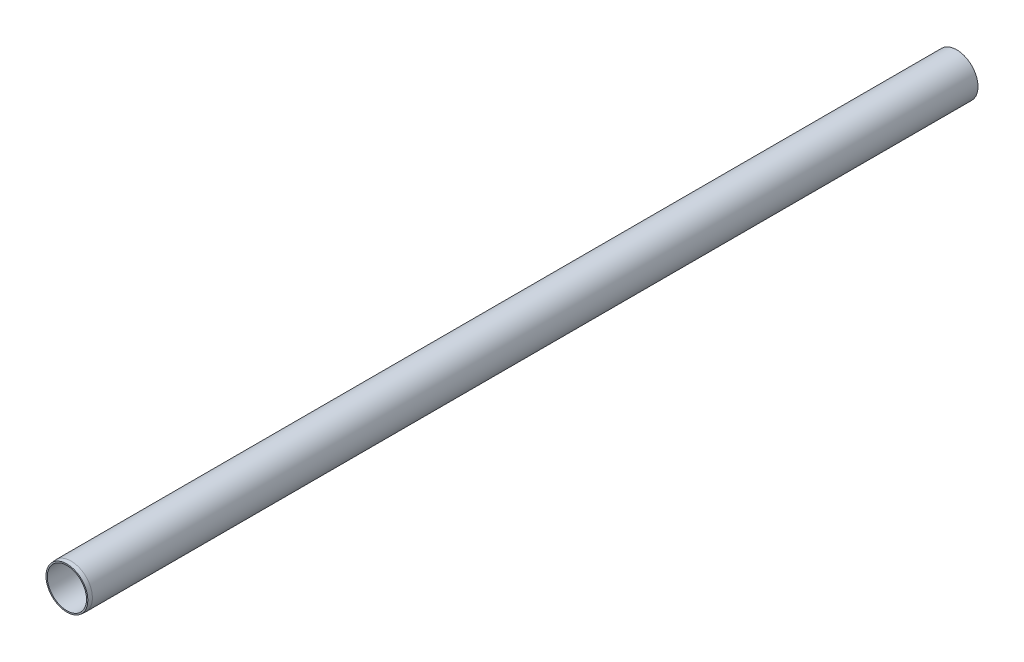
ISO-10303-21;
HEADER;
FILE_DESCRIPTION(('STEP AP214'),'2;1');
FILE_NAME('part.step','',(''),(''),'','','');
FILE_SCHEMA(('AUTOMOTIVE_DESIGN { 1 0 10303 214 1 1 1 1 }'));
ENDSEC;
DATA;
#1=APPLICATION_CONTEXT('core data for automotive mechanical design processes');
#2=APPLICATION_PROTOCOL_DEFINITION('international standard','automotive_design',2000,#1);
#3=PRODUCT_CONTEXT('',#1,'mechanical');
#4=PRODUCT('Part','Part','',(#3));
#5=PRODUCT_RELATED_PRODUCT_CATEGORY('part','',(#4));
#6=PRODUCT_DEFINITION_FORMATION('','',#4);
#7=PRODUCT_DEFINITION_CONTEXT('part definition',#1,'design');
#8=PRODUCT_DEFINITION('design','',#6,#7);
#9=PRODUCT_DEFINITION_SHAPE('','',#8);
#10=(LENGTH_UNIT() NAMED_UNIT(*) SI_UNIT(.MILLI.,.METRE.));
#11=(NAMED_UNIT(*) PLANE_ANGLE_UNIT() SI_UNIT($,.RADIAN.));
#12=(NAMED_UNIT(*) SI_UNIT($,.STERADIAN.) SOLID_ANGLE_UNIT());
#13=UNCERTAINTY_MEASURE_WITH_UNIT(LENGTH_MEASURE(1.E-05),#10,'distance_accuracy_value','');
#14=(GEOMETRIC_REPRESENTATION_CONTEXT(3) GLOBAL_UNCERTAINTY_ASSIGNED_CONTEXT((#13)) GLOBAL_UNIT_ASSIGNED_CONTEXT((#10,
#11,#12)) REPRESENTATION_CONTEXT('',''));
#15=CARTESIAN_POINT('',(0.,0.,0.));
#16=DIRECTION('',(0.,0.,1.));
#17=DIRECTION('',(1.,0.,0.));
#18=AXIS2_PLACEMENT_3D('',#15,#16,#17);
#19=CARTESIAN_POINT('',(0.,0.,863.6));
#20=DIRECTION('',(0.,0.,1.));
#21=DIRECTION('',(1.,0.,0.));
#22=AXIS2_PLACEMENT_3D('',#19,#20,#21);
#23=PLANE('',#22);
#24=CARTESIAN_POINT('',(0.,0.,863.6));
#25=DIRECTION('',(0.,0.,1.));
#26=DIRECTION('',(1.,0.,0.));
#27=AXIS2_PLACEMENT_3D('',#24,#25,#26);
#28=CIRCLE('',#27,20.3199999999999);
#29=CARTESIAN_POINT('',(20.3199999999999,0.,863.6));
#30=VERTEX_POINT('',#29);
#31=EDGE_CURVE('E49',#30,#30,#28,.T.);
#32=ORIENTED_EDGE('',*,*,#31,.T.);
#33=EDGE_LOOP('',(#32));
#34=FACE_BOUND('',#33,.T.);
#35=CARTESIAN_POINT('',(0.,0.,863.6));
#36=DIRECTION('',(0.,0.,1.));
#37=DIRECTION('',(1.,0.,0.));
#38=AXIS2_PLACEMENT_3D('',#35,#36,#37);
#39=CIRCLE('',#38,19.05);
#40=CARTESIAN_POINT('',(19.05,0.,863.6));
#41=VERTEX_POINT('',#40);
#42=EDGE_CURVE('E57',#41,#41,#39,.T.);
#43=ORIENTED_EDGE('',*,*,#42,.F.);
#44=EDGE_LOOP('',(#43));
#45=FACE_BOUND('',#44,.T.);
#46=ADVANCED_FACE('F41',(#34,#45),#23,.T.);
#47=CARTESIAN_POINT('',(0.,0.,0.));
#48=DIRECTION('',(0.,0.,1.));
#49=DIRECTION('',(1.,0.,0.));
#50=AXIS2_PLACEMENT_3D('',#47,#48,#49);
#51=PLANE('',#50);
#52=CARTESIAN_POINT('',(0.,0.,0.));
#53=DIRECTION('',(0.,0.,1.));
#54=DIRECTION('',(1.,0.,0.));
#55=AXIS2_PLACEMENT_3D('',#52,#53,#54);
#56=CIRCLE('',#55,20.6756);
#57=CARTESIAN_POINT('',(20.6756,0.,0.));
#58=VERTEX_POINT('',#57);
#59=EDGE_CURVE('E53',#58,#58,#56,.T.);
#60=ORIENTED_EDGE('',*,*,#59,.F.);
#61=EDGE_LOOP('',(#60));
#62=FACE_BOUND('',#61,.T.);
#63=CARTESIAN_POINT('',(0.,0.,0.));
#64=DIRECTION('',(0.,0.,1.));
#65=DIRECTION('',(1.,0.,0.));
#66=AXIS2_PLACEMENT_3D('',#63,#64,#65);
#67=CIRCLE('',#66,19.05);
#68=CARTESIAN_POINT('',(19.05,0.,0.));
#69=VERTEX_POINT('',#68);
#70=EDGE_CURVE('E60',#69,#69,#67,.T.);
#71=ORIENTED_EDGE('',*,*,#70,.T.);
#72=EDGE_LOOP('',(#71));
#73=FACE_BOUND('',#72,.T.);
#74=ADVANCED_FACE('F70',(#62,#73),#51,.F.);
#75=CARTESIAN_POINT('',(0.,0.,863.6));
#76=DIRECTION('',(0.,0.,-1.));
#77=DIRECTION('',(-1.,0.,0.));
#78=AXIS2_PLACEMENT_3D('',#75,#76,#77);
#79=CYLINDRICAL_SURFACE('',#78,20.6756);
#80=CARTESIAN_POINT('',(0.,0.,859.535473401137));
#81=DIRECTION('',(0.,0.,1.));
#82=DIRECTION('',(1.,0.,0.));
#83=AXIS2_PLACEMENT_3D('',#80,#81,#82);
#84=CIRCLE('',#83,20.6756);
#85=CARTESIAN_POINT('',(20.6756,0.,859.535473401137));
#86=VERTEX_POINT('',#85);
#87=EDGE_CURVE('E10',#86,#86,#84,.F.);
#88=ORIENTED_EDGE('',*,*,#87,.T.);
#89=EDGE_LOOP('',(#88));
#90=FACE_BOUND('',#89,.T.);
#91=ORIENTED_EDGE('',*,*,#59,.T.);
#92=EDGE_LOOP('',(#91));
#93=FACE_BOUND('',#92,.T.);
#94=ADVANCED_FACE('F77',(#90,#93),#79,.T.);
#95=CARTESIAN_POINT('',(0.,0.,863.6));
#96=DIRECTION('',(0.,0.,-1.));
#97=DIRECTION('',(-1.,0.,0.));
#98=AXIS2_PLACEMENT_3D('',#95,#96,#97);
#99=CYLINDRICAL_SURFACE('',#98,19.05);
#100=ORIENTED_EDGE('',*,*,#42,.T.);
#101=EDGE_LOOP('',(#100));
#102=FACE_BOUND('',#101,.T.);
#103=ORIENTED_EDGE('',*,*,#70,.F.);
#104=EDGE_LOOP('',(#103));
#105=FACE_BOUND('',#104,.T.);
#106=ADVANCED_FACE('F66',(#102,#105),#99,.F.);
#107=CARTESIAN_POINT('',(0.,0.,863.6));
#108=DIRECTION('',(0.,0.,-1.));
#109=DIRECTION('',(-1.,0.,0.));
#110=AXIS2_PLACEMENT_3D('',#107,#108,#109);
#111=CONICAL_SURFACE('',#110,20.3199999999999,0.0872664625997159);
#112=ORIENTED_EDGE('',*,*,#87,.F.);
#113=EDGE_LOOP('',(#112));
#114=FACE_BOUND('',#113,.T.);
#115=ORIENTED_EDGE('',*,*,#31,.F.);
#116=EDGE_LOOP('',(#115));
#117=FACE_BOUND('',#116,.T.);
#118=ADVANCED_FACE('F44',(#114,#117),#111,.T.);
#119=CLOSED_SHELL('',(#46,#74,#94,#106,#118));
#120=MANIFOLD_SOLID_BREP('B2',#119);
#121=ADVANCED_BREP_SHAPE_REPRESENTATION('',(#18,#120),#14);
#122=SHAPE_DEFINITION_REPRESENTATION(#9,#121);
ENDSEC;
END-ISO-10303-21;
